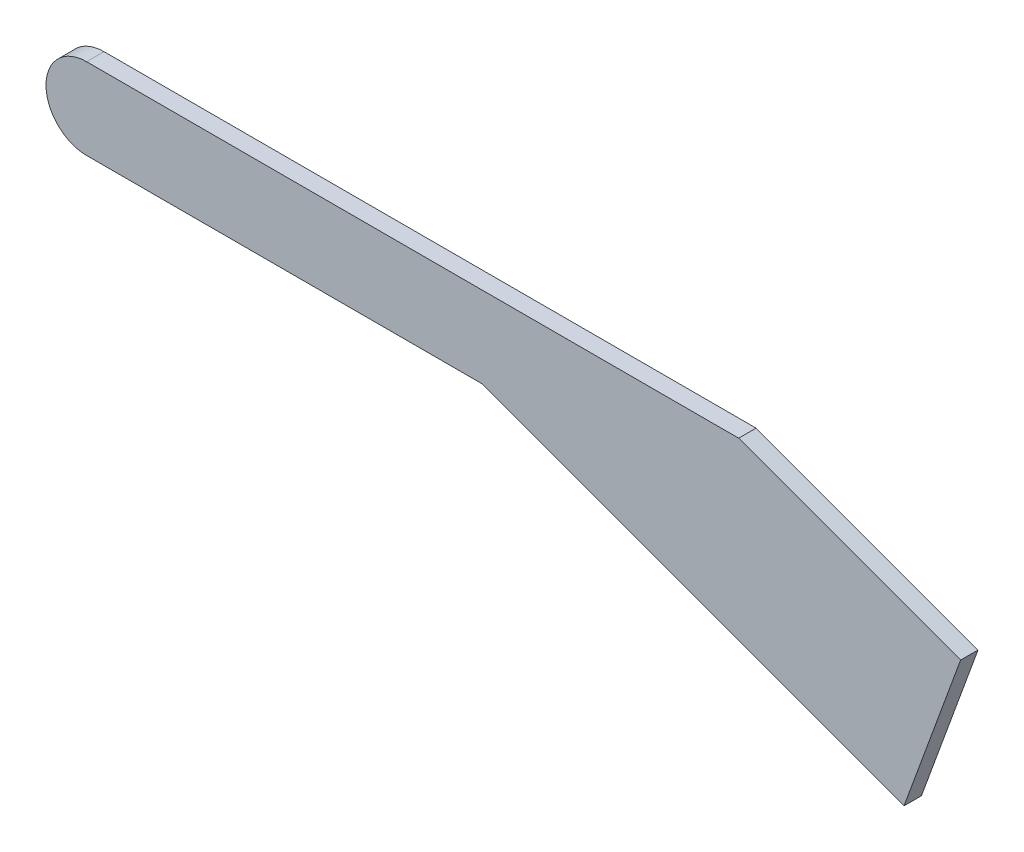
ISO-10303-21;
HEADER;
FILE_DESCRIPTION(('STEP AP214'),'2;1');
FILE_NAME('part.step','',(''),(''),'','','');
FILE_SCHEMA(('AUTOMOTIVE_DESIGN { 1 0 10303 214 1 1 1 1 }'));
ENDSEC;
DATA;
#1=APPLICATION_CONTEXT('core data for automotive mechanical design processes');
#2=APPLICATION_PROTOCOL_DEFINITION('international standard','automotive_design',2000,#1);
#3=PRODUCT_CONTEXT('',#1,'mechanical');
#4=PRODUCT('Part','Part','',(#3));
#5=PRODUCT_RELATED_PRODUCT_CATEGORY('part','',(#4));
#6=PRODUCT_DEFINITION_FORMATION('','',#4);
#7=PRODUCT_DEFINITION_CONTEXT('part definition',#1,'design');
#8=PRODUCT_DEFINITION('design','',#6,#7);
#9=PRODUCT_DEFINITION_SHAPE('','',#8);
#10=(LENGTH_UNIT() NAMED_UNIT(*) SI_UNIT(.MILLI.,.METRE.));
#11=(NAMED_UNIT(*) PLANE_ANGLE_UNIT() SI_UNIT($,.RADIAN.));
#12=(NAMED_UNIT(*) SI_UNIT($,.STERADIAN.) SOLID_ANGLE_UNIT());
#13=UNCERTAINTY_MEASURE_WITH_UNIT(LENGTH_MEASURE(1.E-05),#10,'distance_accuracy_value','');
#14=(GEOMETRIC_REPRESENTATION_CONTEXT(3) GLOBAL_UNCERTAINTY_ASSIGNED_CONTEXT((#13)) GLOBAL_UNIT_ASSIGNED_CONTEXT((#10,
#11,#12)) REPRESENTATION_CONTEXT('',''));
#15=CARTESIAN_POINT('',(0.,0.,0.));
#16=DIRECTION('',(0.,0.,1.));
#17=DIRECTION('',(1.,0.,0.));
#18=AXIS2_PLACEMENT_3D('',#15,#16,#17);
#19=CARTESIAN_POINT('',(0.,-3.5,1.5));
#20=DIRECTION('',(0.,-1.,0.));
#21=DIRECTION('',(0.,0.,-1.));
#22=AXIS2_PLACEMENT_3D('',#19,#20,#21);
#23=PLANE('',#22);
#24=DIRECTION('',(-1.,0.,0.));
#25=VECTOR('',#24,1.);
#26=CARTESIAN_POINT('',(0.,-3.5,0.));
#27=LINE('',#26,#25);
#28=CARTESIAN_POINT('',(34.0607564581146,-3.5,0.));
#29=VERTEX_POINT('',#28);
#30=CARTESIAN_POINT('',(0.,-3.5,0.));
#31=VERTEX_POINT('',#30);
#32=EDGE_CURVE('E138',#29,#31,#27,.T.);
#33=ORIENTED_EDGE('',*,*,#32,.F.);
#34=DIRECTION('',(0.,0.,-1.));
#35=VECTOR('',#34,1.);
#36=CARTESIAN_POINT('',(34.0607564581146,-3.5,1.5));
#37=LINE('',#36,#35);
#38=CARTESIAN_POINT('',(34.0607564581146,-3.5,1.5));
#39=VERTEX_POINT('',#38);
#40=EDGE_CURVE('E64',#39,#29,#37,.T.);
#41=ORIENTED_EDGE('',*,*,#40,.F.);
#42=DIRECTION('',(-1.,0.,0.));
#43=VECTOR('',#42,1.);
#44=CARTESIAN_POINT('',(0.,-3.5,1.5));
#45=LINE('',#44,#43);
#46=CARTESIAN_POINT('',(0.,-3.5,1.5));
#47=VERTEX_POINT('',#46);
#48=EDGE_CURVE('E151',#39,#47,#45,.T.);
#49=ORIENTED_EDGE('',*,*,#48,.T.);
#50=DIRECTION('',(0.,0.,-1.));
#51=VECTOR('',#50,1.);
#52=CARTESIAN_POINT('',(0.,-3.5,1.5));
#53=LINE('',#52,#51);
#54=EDGE_CURVE('E12',#47,#31,#53,.T.);
#55=ORIENTED_EDGE('',*,*,#54,.T.);
#56=EDGE_LOOP('',(#33,#41,#49,#55));
#57=FACE_BOUND('',#56,.T.);
#58=ADVANCED_FACE('F54',(#57),#23,.T.);
#59=CARTESIAN_POINT('',(2.89462890717873,7.90799532686563,1.5));
#60=DIRECTION('',(-0.34373442183548,-0.93906690243317,0.));
#61=DIRECTION('',(0.93906690243317,-0.34373442183548,0.));
#62=AXIS2_PLACEMENT_3D('',#59,#60,#61);
#63=PLANE('',#62);
#64=DIRECTION('',(-0.93906690243317,0.34373442183548,0.));
#65=VECTOR('',#64,1.);
#66=CARTESIAN_POINT('',(2.89462890717873,7.90799532686563,0.));
#67=LINE('',#66,#65);
#68=CARTESIAN_POINT('',(70.446894758896,-16.8187190169712,0.));
#69=VERTEX_POINT('',#68);
#70=EDGE_CURVE('E141',#69,#29,#67,.T.);
#71=ORIENTED_EDGE('',*,*,#70,.F.);
#72=DIRECTION('',(0.,0.,-1.));
#73=VECTOR('',#72,1.);
#74=CARTESIAN_POINT('',(70.446894758896,-16.8187190169712,1.5));
#75=LINE('',#74,#73);
#76=CARTESIAN_POINT('',(70.446894758896,-16.8187190169712,1.5));
#77=VERTEX_POINT('',#76);
#78=EDGE_CURVE('E120',#77,#69,#75,.T.);
#79=ORIENTED_EDGE('',*,*,#78,.F.);
#80=DIRECTION('',(-0.93906690243317,0.34373442183548,0.));
#81=VECTOR('',#80,1.);
#82=CARTESIAN_POINT('',(2.89462890717873,7.90799532686563,1.5));
#83=LINE('',#82,#81);
#84=EDGE_CURVE('E130',#77,#39,#83,.T.);
#85=ORIENTED_EDGE('',*,*,#84,.T.);
#86=ORIENTED_EDGE('',*,*,#40,.T.);
#87=EDGE_LOOP('',(#71,#79,#85,#86));
#88=FACE_BOUND('',#87,.T.);
#89=ADVANCED_FACE('F163',(#88),#63,.T.);
#90=CARTESIAN_POINT('',(67.5522658517173,-24.7267143438369,1.5));
#91=DIRECTION('',(0.93906690243317,-0.34373442183548,0.));
#92=DIRECTION('',(0.34373442183548,0.93906690243317,0.));
#93=AXIS2_PLACEMENT_3D('',#90,#91,#92);
#94=PLANE('',#93);
#95=DIRECTION('',(-0.34373442183548,-0.93906690243317,0.));
#96=VECTOR('',#95,1.);
#97=CARTESIAN_POINT('',(67.5522658517173,-24.7267143438369,0.));
#98=LINE('',#97,#96);
#99=CARTESIAN_POINT('',(75.3220555903829,-3.5,0.));
#100=VERTEX_POINT('',#99);
#101=EDGE_CURVE('E116',#100,#69,#98,.T.);
#102=ORIENTED_EDGE('',*,*,#101,.F.);
#103=DIRECTION('',(0.,0.,-1.));
#104=VECTOR('',#103,1.);
#105=CARTESIAN_POINT('',(75.3220555903829,-3.5,1.5));
#106=LINE('',#105,#104);
#107=CARTESIAN_POINT('',(75.3220555903829,-3.5,1.5));
#108=VERTEX_POINT('',#107);
#109=EDGE_CURVE('E111',#108,#100,#106,.T.);
#110=ORIENTED_EDGE('',*,*,#109,.F.);
#111=DIRECTION('',(-0.34373442183548,-0.93906690243317,0.));
#112=VECTOR('',#111,1.);
#113=CARTESIAN_POINT('',(67.5522658517173,-24.7267143438369,1.5));
#114=LINE('',#113,#112);
#115=EDGE_CURVE('E114',#108,#77,#114,.T.);
#116=ORIENTED_EDGE('',*,*,#115,.T.);
#117=ORIENTED_EDGE('',*,*,#78,.T.);
#118=EDGE_LOOP('',(#102,#110,#116,#117));
#119=FACE_BOUND('',#118,.T.);
#120=ADVANCED_FACE('F113',(#119),#94,.T.);
#121=CARTESIAN_POINT('',(7.76978973866553,21.2267143438369,1.5));
#122=DIRECTION('',(0.34373442183548,0.939066902433169,0.));
#123=DIRECTION('',(-0.93906690243317,0.34373442183548,0.));
#124=AXIS2_PLACEMENT_3D('',#121,#122,#123);
#125=PLANE('',#124);
#126=DIRECTION('',(0.93906690243317,-0.34373442183548,0.));
#127=VECTOR('',#126,1.);
#128=CARTESIAN_POINT('',(7.76978973866553,21.2267143438369,0.));
#129=LINE('',#128,#127);
#130=CARTESIAN_POINT('',(56.1983720153395,3.5,0.));
#131=VERTEX_POINT('',#130);
#132=EDGE_CURVE('E146',#131,#100,#129,.T.);
#133=ORIENTED_EDGE('',*,*,#132,.F.);
#134=DIRECTION('',(0.,0.,-1.));
#135=VECTOR('',#134,1.);
#136=CARTESIAN_POINT('',(56.1983720153395,3.5,1.5));
#137=LINE('',#136,#135);
#138=CARTESIAN_POINT('',(56.1983720153395,3.5,1.5));
#139=VERTEX_POINT('',#138);
#140=EDGE_CURVE('E92',#139,#131,#137,.T.);
#141=ORIENTED_EDGE('',*,*,#140,.F.);
#142=DIRECTION('',(0.93906690243317,-0.34373442183548,0.));
#143=VECTOR('',#142,1.);
#144=CARTESIAN_POINT('',(7.76978973866553,21.2267143438369,1.5));
#145=LINE('',#144,#143);
#146=EDGE_CURVE('E127',#139,#108,#145,.T.);
#147=ORIENTED_EDGE('',*,*,#146,.T.);
#148=ORIENTED_EDGE('',*,*,#109,.T.);
#149=EDGE_LOOP('',(#133,#141,#147,#148));
#150=FACE_BOUND('',#149,.T.);
#151=ADVANCED_FACE('F132',(#150),#125,.T.);
#152=CARTESIAN_POINT('',(0.,3.5,1.5));
#153=DIRECTION('',(0.,1.,0.));
#154=DIRECTION('',(0.,0.,1.));
#155=AXIS2_PLACEMENT_3D('',#152,#153,#154);
#156=PLANE('',#155);
#157=DIRECTION('',(1.,0.,0.));
#158=VECTOR('',#157,1.);
#159=CARTESIAN_POINT('',(0.,3.5,0.));
#160=LINE('',#159,#158);
#161=CARTESIAN_POINT('',(0.,3.5,0.));
#162=VERTEX_POINT('',#161);
#163=EDGE_CURVE('E148',#162,#131,#160,.T.);
#164=ORIENTED_EDGE('',*,*,#163,.F.);
#165=DIRECTION('',(0.,0.,-1.));
#166=VECTOR('',#165,1.);
#167=CARTESIAN_POINT('',(0.,3.5,1.5));
#168=LINE('',#167,#166);
#169=CARTESIAN_POINT('',(0.,3.5,1.5));
#170=VERTEX_POINT('',#169);
#171=EDGE_CURVE('E73',#170,#162,#168,.T.);
#172=ORIENTED_EDGE('',*,*,#171,.F.);
#173=DIRECTION('',(1.,0.,0.));
#174=VECTOR('',#173,1.);
#175=CARTESIAN_POINT('',(0.,3.5,1.5));
#176=LINE('',#175,#174);
#177=EDGE_CURVE('E133',#170,#139,#176,.T.);
#178=ORIENTED_EDGE('',*,*,#177,.T.);
#179=ORIENTED_EDGE('',*,*,#140,.T.);
#180=EDGE_LOOP('',(#164,#172,#178,#179));
#181=FACE_BOUND('',#180,.T.);
#182=ADVANCED_FACE('F164',(#181),#156,.T.);
#183=CARTESIAN_POINT('',(0.,0.,0.));
#184=DIRECTION('',(0.,0.,1.));
#185=DIRECTION('',(1.,0.,0.));
#186=AXIS2_PLACEMENT_3D('',#183,#184,#185);
#187=PLANE('',#186);
#188=ORIENTED_EDGE('',*,*,#32,.T.);
#189=CARTESIAN_POINT('',(0.,0.,0.));
#190=DIRECTION('',(0.,0.,1.));
#191=DIRECTION('',(1.,0.,0.));
#192=AXIS2_PLACEMENT_3D('',#189,#190,#191);
#193=CIRCLE('',#192,3.5);
#194=EDGE_CURVE('E58',#162,#31,#193,.T.);
#195=ORIENTED_EDGE('',*,*,#194,.F.);
#196=ORIENTED_EDGE('',*,*,#163,.T.);
#197=ORIENTED_EDGE('',*,*,#132,.T.);
#198=ORIENTED_EDGE('',*,*,#101,.T.);
#199=ORIENTED_EDGE('',*,*,#70,.T.);
#200=EDGE_LOOP('',(#188,#195,#196,#197,#198,#199));
#201=FACE_BOUND('',#200,.T.);
#202=ADVANCED_FACE('F158',(#201),#187,.F.);
#203=CARTESIAN_POINT('',(0.,0.,1.5));
#204=DIRECTION('',(0.,0.,1.));
#205=DIRECTION('',(1.,0.,0.));
#206=AXIS2_PLACEMENT_3D('',#203,#204,#205);
#207=PLANE('',#206);
#208=ORIENTED_EDGE('',*,*,#177,.F.);
#209=CARTESIAN_POINT('',(0.,0.,1.5));
#210=DIRECTION('',(0.,0.,1.));
#211=DIRECTION('',(1.,0.,0.));
#212=AXIS2_PLACEMENT_3D('',#209,#210,#211);
#213=CIRCLE('',#212,3.5);
#214=EDGE_CURVE('E142',#170,#47,#213,.T.);
#215=ORIENTED_EDGE('',*,*,#214,.T.);
#216=ORIENTED_EDGE('',*,*,#48,.F.);
#217=ORIENTED_EDGE('',*,*,#84,.F.);
#218=ORIENTED_EDGE('',*,*,#115,.F.);
#219=ORIENTED_EDGE('',*,*,#146,.F.);
#220=EDGE_LOOP('',(#208,#215,#216,#217,#218,#219));
#221=FACE_BOUND('',#220,.T.);
#222=ADVANCED_FACE('F126',(#221),#207,.T.);
#223=CARTESIAN_POINT('',(0.,0.,1.5));
#224=DIRECTION('',(0.,0.,-1.));
#225=DIRECTION('',(-1.,0.,0.));
#226=AXIS2_PLACEMENT_3D('',#223,#224,#225);
#227=CYLINDRICAL_SURFACE('',#226,3.5);
#228=ORIENTED_EDGE('',*,*,#194,.T.);
#229=ORIENTED_EDGE('',*,*,#54,.F.);
#230=ORIENTED_EDGE('',*,*,#214,.F.);
#231=ORIENTED_EDGE('',*,*,#171,.T.);
#232=EDGE_LOOP('',(#228,#229,#230,#231));
#233=FACE_BOUND('',#232,.T.);
#234=ADVANCED_FACE('F56',(#233),#227,.T.);
#235=CLOSED_SHELL('',(#58,#89,#120,#151,#182,#202,#222,#234));
#236=MANIFOLD_SOLID_BREP('B2',#235);
#237=ADVANCED_BREP_SHAPE_REPRESENTATION('',(#18,#236),#14);
#238=SHAPE_DEFINITION_REPRESENTATION(#9,#237);
ENDSEC;
END-ISO-10303-21;
